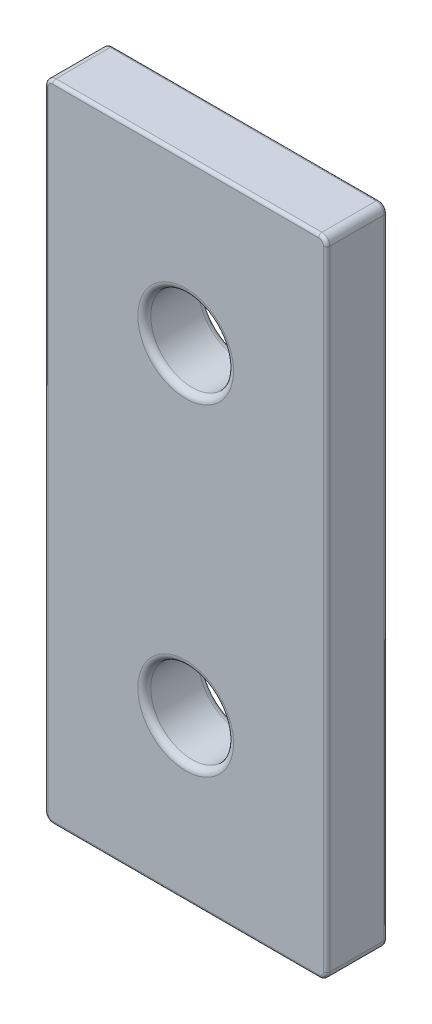
ISO-10303-21;
HEADER;
FILE_DESCRIPTION(('STEP AP214'),'2;1');
FILE_NAME('part.step','',(''),(''),'','','');
FILE_SCHEMA(('AUTOMOTIVE_DESIGN { 1 0 10303 214 1 1 1 1 }'));
ENDSEC;
DATA;
#1=APPLICATION_CONTEXT('core data for automotive mechanical design processes');
#2=APPLICATION_PROTOCOL_DEFINITION('international standard','automotive_design',2000,#1);
#3=PRODUCT_CONTEXT('',#1,'mechanical');
#4=PRODUCT('Part','Part','',(#3));
#5=PRODUCT_RELATED_PRODUCT_CATEGORY('part','',(#4));
#6=PRODUCT_DEFINITION_FORMATION('','',#4);
#7=PRODUCT_DEFINITION_CONTEXT('part definition',#1,'design');
#8=PRODUCT_DEFINITION('design','',#6,#7);
#9=PRODUCT_DEFINITION_SHAPE('','',#8);
#10=(LENGTH_UNIT() NAMED_UNIT(*) SI_UNIT(.MILLI.,.METRE.));
#11=(NAMED_UNIT(*) PLANE_ANGLE_UNIT() SI_UNIT($,.RADIAN.));
#12=(NAMED_UNIT(*) SI_UNIT($,.STERADIAN.) SOLID_ANGLE_UNIT());
#13=UNCERTAINTY_MEASURE_WITH_UNIT(LENGTH_MEASURE(1.E-05),#10,'distance_accuracy_value','');
#14=(GEOMETRIC_REPRESENTATION_CONTEXT(3) GLOBAL_UNCERTAINTY_ASSIGNED_CONTEXT((#13)) GLOBAL_UNIT_ASSIGNED_CONTEXT((#10,
#11,#12)) REPRESENTATION_CONTEXT('',''));
#15=CARTESIAN_POINT('',(0.,0.,0.));
#16=DIRECTION('',(0.,0.,1.));
#17=DIRECTION('',(1.,0.,0.));
#18=AXIS2_PLACEMENT_3D('',#15,#16,#17);
#19=CARTESIAN_POINT('',(-11.1125,25.4,2.3876));
#20=DIRECTION('',(0.,-1.,0.));
#21=DIRECTION('',(0.,0.,-1.));
#22=AXIS2_PLACEMENT_3D('',#19,#20,#21);
#23=PLANE('',#22);
#24=DIRECTION('',(0.,0.,-1.));
#25=VECTOR('',#24,1.);
#26=CARTESIAN_POINT('',(10.4775,25.4,2.3876));
#27=LINE('',#26,#25);
#28=CARTESIAN_POINT('',(10.4775,25.4,2.1336));
#29=VERTEX_POINT('',#28);
#30=CARTESIAN_POINT('',(10.4775,25.4,-2.1336));
#31=VERTEX_POINT('',#30);
#32=EDGE_CURVE('E195',#29,#31,#27,.T.);
#33=ORIENTED_EDGE('',*,*,#32,.T.);
#34=DIRECTION('',(-1.,0.,0.));
#35=VECTOR('',#34,1.);
#36=CARTESIAN_POINT('',(-10.4775,25.4,-2.1336));
#37=LINE('',#36,#35);
#38=CARTESIAN_POINT('',(-10.4775,25.4,-2.1336));
#39=VERTEX_POINT('',#38);
#40=EDGE_CURVE('E251',#31,#39,#37,.T.);
#41=ORIENTED_EDGE('',*,*,#40,.T.);
#42=DIRECTION('',(0.,0.,-1.));
#43=VECTOR('',#42,1.);
#44=CARTESIAN_POINT('',(-10.4775,25.4,2.3876));
#45=LINE('',#44,#43);
#46=CARTESIAN_POINT('',(-10.4775,25.4,2.1336));
#47=VERTEX_POINT('',#46);
#48=EDGE_CURVE('E190',#39,#47,#45,.F.);
#49=ORIENTED_EDGE('',*,*,#48,.T.);
#50=DIRECTION('',(-1.,0.,0.));
#51=VECTOR('',#50,1.);
#52=CARTESIAN_POINT('',(-11.1125,25.4,2.1336));
#53=LINE('',#52,#51);
#54=EDGE_CURVE('E248',#47,#29,#53,.F.);
#55=ORIENTED_EDGE('',*,*,#54,.T.);
#56=EDGE_LOOP('',(#33,#41,#49,#55));
#57=FACE_BOUND('',#56,.T.);
#58=ADVANCED_FACE('F48',(#57),#23,.F.);
#59=CARTESIAN_POINT('',(-11.1125,25.4,2.3876));
#60=DIRECTION('',(1.,0.,0.));
#61=DIRECTION('',(0.,0.,-1.));
#62=AXIS2_PLACEMENT_3D('',#59,#60,#61);
#63=PLANE('',#62);
#64=DIRECTION('',(0.,0.,-1.));
#65=VECTOR('',#64,1.);
#66=CARTESIAN_POINT('',(-11.1125,24.765,2.3876));
#67=LINE('',#66,#65);
#68=CARTESIAN_POINT('',(-11.1125,24.765,2.1336));
#69=VERTEX_POINT('',#68);
#70=CARTESIAN_POINT('',(-11.1125,24.765,-2.1336));
#71=VERTEX_POINT('',#70);
#72=EDGE_CURVE('E537',#69,#71,#67,.T.);
#73=ORIENTED_EDGE('',*,*,#72,.T.);
#74=DIRECTION('',(0.,-1.,0.));
#75=VECTOR('',#74,1.);
#76=CARTESIAN_POINT('',(-11.1125,-24.765,-2.1336));
#77=LINE('',#76,#75);
#78=CARTESIAN_POINT('',(-11.1125,-24.765,-2.1336));
#79=VERTEX_POINT('',#78);
#80=EDGE_CURVE('E239',#71,#79,#77,.T.);
#81=ORIENTED_EDGE('',*,*,#80,.T.);
#82=DIRECTION('',(0.,0.,-1.));
#83=VECTOR('',#82,1.);
#84=CARTESIAN_POINT('',(-11.1125,-24.765,2.3876));
#85=LINE('',#84,#83);
#86=CARTESIAN_POINT('',(-11.1125,-24.765,2.1336));
#87=VERTEX_POINT('',#86);
#88=EDGE_CURVE('E541',#79,#87,#85,.F.);
#89=ORIENTED_EDGE('',*,*,#88,.T.);
#90=DIRECTION('',(0.,-1.,0.));
#91=VECTOR('',#90,1.);
#92=CARTESIAN_POINT('',(-11.1125,25.4,2.1336));
#93=LINE('',#92,#91);
#94=EDGE_CURVE('E236',#87,#69,#93,.F.);
#95=ORIENTED_EDGE('',*,*,#94,.T.);
#96=EDGE_LOOP('',(#73,#81,#89,#95));
#97=FACE_BOUND('',#96,.T.);
#98=ADVANCED_FACE('F393',(#97),#63,.F.);
#99=CARTESIAN_POINT('',(-11.1125,-25.4,2.3876));
#100=DIRECTION('',(0.,1.,0.));
#101=DIRECTION('',(0.,0.,1.));
#102=AXIS2_PLACEMENT_3D('',#99,#100,#101);
#103=PLANE('',#102);
#104=DIRECTION('',(0.,0.,-1.));
#105=VECTOR('',#104,1.);
#106=CARTESIAN_POINT('',(-10.4775,-25.4,2.3876));
#107=LINE('',#106,#105);
#108=CARTESIAN_POINT('',(-10.4775,-25.4,2.1336));
#109=VERTEX_POINT('',#108);
#110=CARTESIAN_POINT('',(-10.4775,-25.4,-2.1336));
#111=VERTEX_POINT('',#110);
#112=EDGE_CURVE('E507',#109,#111,#107,.T.);
#113=ORIENTED_EDGE('',*,*,#112,.T.);
#114=DIRECTION('',(1.,0.,0.));
#115=VECTOR('',#114,1.);
#116=CARTESIAN_POINT('',(10.4775,-25.4,-2.1336));
#117=LINE('',#116,#115);
#118=CARTESIAN_POINT('',(10.4775,-25.4,-2.1336));
#119=VERTEX_POINT('',#118);
#120=EDGE_CURVE('E227',#111,#119,#117,.T.);
#121=ORIENTED_EDGE('',*,*,#120,.T.);
#122=DIRECTION('',(0.,0.,-1.));
#123=VECTOR('',#122,1.);
#124=CARTESIAN_POINT('',(10.4775,-25.4,2.3876));
#125=LINE('',#124,#123);
#126=CARTESIAN_POINT('',(10.4775,-25.4,2.1336));
#127=VERTEX_POINT('',#126);
#128=EDGE_CURVE('E515',#119,#127,#125,.F.);
#129=ORIENTED_EDGE('',*,*,#128,.T.);
#130=DIRECTION('',(1.,0.,0.));
#131=VECTOR('',#130,1.);
#132=CARTESIAN_POINT('',(-11.1125,-25.4,2.1336));
#133=LINE('',#132,#131);
#134=EDGE_CURVE('E224',#127,#109,#133,.F.);
#135=ORIENTED_EDGE('',*,*,#134,.T.);
#136=EDGE_LOOP('',(#113,#121,#129,#135));
#137=FACE_BOUND('',#136,.T.);
#138=ADVANCED_FACE('F399',(#137),#103,.F.);
#139=CARTESIAN_POINT('',(11.1125,25.4,2.3876));
#140=DIRECTION('',(-1.,0.,0.));
#141=DIRECTION('',(0.,0.,1.));
#142=AXIS2_PLACEMENT_3D('',#139,#140,#141);
#143=PLANE('',#142);
#144=DIRECTION('',(0.,0.,-1.));
#145=VECTOR('',#144,1.);
#146=CARTESIAN_POINT('',(11.1125,-24.765,2.3876));
#147=LINE('',#146,#145);
#148=CARTESIAN_POINT('',(11.1125,-24.765,2.1336));
#149=VERTEX_POINT('',#148);
#150=CARTESIAN_POINT('',(11.1125,-24.765,-2.1336));
#151=VERTEX_POINT('',#150);
#152=EDGE_CURVE('E516',#149,#151,#147,.T.);
#153=ORIENTED_EDGE('',*,*,#152,.T.);
#154=DIRECTION('',(0.,1.,0.));
#155=VECTOR('',#154,1.);
#156=CARTESIAN_POINT('',(11.1125,24.765,-2.1336));
#157=LINE('',#156,#155);
#158=CARTESIAN_POINT('',(11.1125,24.765,-2.1336));
#159=VERTEX_POINT('',#158);
#160=EDGE_CURVE('E284',#151,#159,#157,.T.);
#161=ORIENTED_EDGE('',*,*,#160,.T.);
#162=DIRECTION('',(0.,0.,-1.));
#163=VECTOR('',#162,1.);
#164=CARTESIAN_POINT('',(11.1125,24.765,2.3876));
#165=LINE('',#164,#163);
#166=CARTESIAN_POINT('',(11.1125,24.765,2.1336));
#167=VERTEX_POINT('',#166);
#168=EDGE_CURVE('E311',#159,#167,#165,.F.);
#169=ORIENTED_EDGE('',*,*,#168,.T.);
#170=DIRECTION('',(0.,1.,0.));
#171=VECTOR('',#170,1.);
#172=CARTESIAN_POINT('',(11.1125,25.4,2.1336));
#173=LINE('',#172,#171);
#174=EDGE_CURVE('E281',#167,#149,#173,.F.);
#175=ORIENTED_EDGE('',*,*,#174,.T.);
#176=EDGE_LOOP('',(#153,#161,#169,#175));
#177=FACE_BOUND('',#176,.T.);
#178=ADVANCED_FACE('F491',(#177),#143,.F.);
#179=CARTESIAN_POINT('',(0.,0.,2.3876));
#180=DIRECTION('',(0.,0.,-1.));
#181=DIRECTION('',(-1.,0.,0.));
#182=AXIS2_PLACEMENT_3D('',#179,#180,#181);
#183=PLANE('',#182);
#184=CARTESIAN_POINT('',(0.,12.7,2.3876));
#185=DIRECTION('',(0.,0.,-1.));
#186=DIRECTION('',(-1.,0.,0.));
#187=AXIS2_PLACEMENT_3D('',#184,#185,#186);
#188=CIRCLE('',#187,3.7719);
#189=CARTESIAN_POINT('',(-3.7719,12.7,2.3876));
#190=VERTEX_POINT('',#189);
#191=EDGE_CURVE('E11',#190,#190,#188,.T.);
#192=ORIENTED_EDGE('',*,*,#191,.T.);
#193=EDGE_LOOP('',(#192));
#194=FACE_BOUND('',#193,.T.);
#195=CARTESIAN_POINT('',(0.,-12.7,2.3876));
#196=DIRECTION('',(0.,0.,-1.));
#197=DIRECTION('',(-1.,0.,0.));
#198=AXIS2_PLACEMENT_3D('',#195,#196,#197);
#199=CIRCLE('',#198,3.7719);
#200=CARTESIAN_POINT('',(-3.7719,-12.7,2.3876));
#201=VERTEX_POINT('',#200);
#202=EDGE_CURVE('E57',#201,#201,#199,.T.);
#203=ORIENTED_EDGE('',*,*,#202,.T.);
#204=EDGE_LOOP('',(#203));
#205=FACE_BOUND('',#204,.T.);
#206=DIRECTION('',(1.,0.,0.));
#207=VECTOR('',#206,1.);
#208=CARTESIAN_POINT('',(0.,-25.146,2.3876));
#209=LINE('',#208,#207);
#210=CARTESIAN_POINT('',(-10.4775,-25.146,2.3876));
#211=VERTEX_POINT('',#210);
#212=CARTESIAN_POINT('',(10.4775,-25.146,2.3876));
#213=VERTEX_POINT('',#212);
#214=EDGE_CURVE('E64',#211,#213,#209,.T.);
#215=ORIENTED_EDGE('',*,*,#214,.T.);
#216=CARTESIAN_POINT('',(10.4775,-24.765,2.3876));
#217=DIRECTION('',(0.,0.,-1.));
#218=DIRECTION('',(-1.,0.,0.));
#219=AXIS2_PLACEMENT_3D('',#216,#217,#218);
#220=CIRCLE('',#219,0.381);
#221=CARTESIAN_POINT('',(10.8585,-24.765,2.3876));
#222=VERTEX_POINT('',#221);
#223=EDGE_CURVE('E278',#213,#222,#220,.F.);
#224=ORIENTED_EDGE('',*,*,#223,.T.);
#225=DIRECTION('',(0.,1.,0.));
#226=VECTOR('',#225,1.);
#227=CARTESIAN_POINT('',(10.8585,0.,2.3876));
#228=LINE('',#227,#226);
#229=CARTESIAN_POINT('',(10.8585,24.765,2.3876));
#230=VERTEX_POINT('',#229);
#231=EDGE_CURVE('E259',#222,#230,#228,.T.);
#232=ORIENTED_EDGE('',*,*,#231,.T.);
#233=CARTESIAN_POINT('',(10.4775,24.765,2.3876));
#234=DIRECTION('',(0.,0.,-1.));
#235=DIRECTION('',(-1.,0.,0.));
#236=AXIS2_PLACEMENT_3D('',#233,#234,#235);
#237=CIRCLE('',#236,0.381);
#238=CARTESIAN_POINT('',(10.4775,25.146,2.3876));
#239=VERTEX_POINT('',#238);
#240=EDGE_CURVE('E262',#230,#239,#237,.F.);
#241=ORIENTED_EDGE('',*,*,#240,.T.);
#242=DIRECTION('',(-1.,0.,0.));
#243=VECTOR('',#242,1.);
#244=CARTESIAN_POINT('',(0.,25.146,2.3876));
#245=LINE('',#244,#243);
#246=CARTESIAN_POINT('',(-10.4775,25.146,2.3876));
#247=VERTEX_POINT('',#246);
#248=EDGE_CURVE('E265',#239,#247,#245,.T.);
#249=ORIENTED_EDGE('',*,*,#248,.T.);
#250=CARTESIAN_POINT('',(-10.4775,24.765,2.3876));
#251=DIRECTION('',(0.,0.,-1.));
#252=DIRECTION('',(-1.,0.,0.));
#253=AXIS2_PLACEMENT_3D('',#250,#251,#252);
#254=CIRCLE('',#253,0.381);
#255=CARTESIAN_POINT('',(-10.8585,24.765,2.3876));
#256=VERTEX_POINT('',#255);
#257=EDGE_CURVE('E268',#247,#256,#254,.F.);
#258=ORIENTED_EDGE('',*,*,#257,.T.);
#259=DIRECTION('',(0.,-1.,0.));
#260=VECTOR('',#259,1.);
#261=CARTESIAN_POINT('',(-10.8585,0.,2.3876));
#262=LINE('',#261,#260);
#263=CARTESIAN_POINT('',(-10.8585,-24.765,2.3876));
#264=VERTEX_POINT('',#263);
#265=EDGE_CURVE('E271',#256,#264,#262,.T.);
#266=ORIENTED_EDGE('',*,*,#265,.T.);
#267=CARTESIAN_POINT('',(-10.4775,-24.765,2.3876));
#268=DIRECTION('',(0.,0.,-1.));
#269=DIRECTION('',(-1.,0.,0.));
#270=AXIS2_PLACEMENT_3D('',#267,#268,#269);
#271=CIRCLE('',#270,0.381);
#272=EDGE_CURVE('E69',#264,#211,#271,.F.);
#273=ORIENTED_EDGE('',*,*,#272,.T.);
#274=EDGE_LOOP('',(#215,#224,#232,#241,#249,#258,#266,#273));
#275=FACE_BOUND('',#274,.T.);
#276=ADVANCED_FACE('F368',(#194,#205,#275),#183,.F.);
#277=CARTESIAN_POINT('',(0.,0.,-2.3876));
#278=DIRECTION('',(0.,0.,-1.));
#279=DIRECTION('',(-1.,0.,0.));
#280=AXIS2_PLACEMENT_3D('',#277,#278,#279);
#281=PLANE('',#280);
#282=CARTESIAN_POINT('',(0.,12.7,-2.3876));
#283=DIRECTION('',(0.,0.,-1.));
#284=DIRECTION('',(-1.,0.,0.));
#285=AXIS2_PLACEMENT_3D('',#282,#283,#284);
#286=CIRCLE('',#285,3.7719);
#287=CARTESIAN_POINT('',(-3.7719,12.7,-2.3876));
#288=VERTEX_POINT('',#287);
#289=EDGE_CURVE('E344',#288,#288,#286,.F.);
#290=ORIENTED_EDGE('',*,*,#289,.T.);
#291=EDGE_LOOP('',(#290));
#292=FACE_BOUND('',#291,.T.);
#293=CARTESIAN_POINT('',(0.,-12.7,-2.3876));
#294=DIRECTION('',(0.,0.,-1.));
#295=DIRECTION('',(-1.,0.,0.));
#296=AXIS2_PLACEMENT_3D('',#293,#294,#295);
#297=CIRCLE('',#296,3.7719);
#298=CARTESIAN_POINT('',(-3.7719,-12.7,-2.3876));
#299=VERTEX_POINT('',#298);
#300=EDGE_CURVE('E287',#299,#299,#297,.F.);
#301=ORIENTED_EDGE('',*,*,#300,.T.);
#302=EDGE_LOOP('',(#301));
#303=FACE_BOUND('',#302,.T.);
#304=DIRECTION('',(0.,1.,0.));
#305=VECTOR('',#304,1.);
#306=CARTESIAN_POINT('',(10.8585,-24.765,-2.3876));
#307=LINE('',#306,#305);
#308=CARTESIAN_POINT('',(10.8585,24.765,-2.3876));
#309=VERTEX_POINT('',#308);
#310=CARTESIAN_POINT('',(10.8585,-24.765,-2.3876));
#311=VERTEX_POINT('',#310);
#312=EDGE_CURVE('E166',#309,#311,#307,.F.);
#313=ORIENTED_EDGE('',*,*,#312,.T.);
#314=CARTESIAN_POINT('',(10.4775,-24.765,-2.3876));
#315=DIRECTION('',(0.,0.,-1.));
#316=DIRECTION('',(-1.,0.,0.));
#317=AXIS2_PLACEMENT_3D('',#314,#315,#316);
#318=CIRCLE('',#317,0.381);
#319=CARTESIAN_POINT('',(10.4775,-25.146,-2.3876));
#320=VERTEX_POINT('',#319);
#321=EDGE_CURVE('E213',#311,#320,#318,.T.);
#322=ORIENTED_EDGE('',*,*,#321,.T.);
#323=DIRECTION('',(1.,0.,0.));
#324=VECTOR('',#323,1.);
#325=CARTESIAN_POINT('',(-10.4775,-25.146,-2.3876));
#326=LINE('',#325,#324);
#327=CARTESIAN_POINT('',(-10.4775,-25.146,-2.3876));
#328=VERTEX_POINT('',#327);
#329=EDGE_CURVE('E210',#320,#328,#326,.F.);
#330=ORIENTED_EDGE('',*,*,#329,.T.);
#331=CARTESIAN_POINT('',(-10.4775,-24.765,-2.3876));
#332=DIRECTION('',(0.,0.,-1.));
#333=DIRECTION('',(-1.,0.,0.));
#334=AXIS2_PLACEMENT_3D('',#331,#332,#333);
#335=CIRCLE('',#334,0.381);
#336=CARTESIAN_POINT('',(-10.8585,-24.765,-2.3876));
#337=VERTEX_POINT('',#336);
#338=EDGE_CURVE('E207',#328,#337,#335,.T.);
#339=ORIENTED_EDGE('',*,*,#338,.T.);
#340=DIRECTION('',(0.,-1.,0.));
#341=VECTOR('',#340,1.);
#342=CARTESIAN_POINT('',(-10.8585,24.765,-2.3876));
#343=LINE('',#342,#341);
#344=CARTESIAN_POINT('',(-10.8585,24.765,-2.3876));
#345=VERTEX_POINT('',#344);
#346=EDGE_CURVE('E204',#337,#345,#343,.F.);
#347=ORIENTED_EDGE('',*,*,#346,.T.);
#348=CARTESIAN_POINT('',(-10.4775,24.765,-2.3876));
#349=DIRECTION('',(0.,0.,-1.));
#350=DIRECTION('',(-1.,0.,0.));
#351=AXIS2_PLACEMENT_3D('',#348,#349,#350);
#352=CIRCLE('',#351,0.381);
#353=CARTESIAN_POINT('',(-10.4775,25.146,-2.3876));
#354=VERTEX_POINT('',#353);
#355=EDGE_CURVE('E201',#345,#354,#352,.T.);
#356=ORIENTED_EDGE('',*,*,#355,.T.);
#357=DIRECTION('',(-1.,0.,0.));
#358=VECTOR('',#357,1.);
#359=CARTESIAN_POINT('',(10.4775,25.146,-2.3876));
#360=LINE('',#359,#358);
#361=CARTESIAN_POINT('',(10.4775,25.146,-2.3876));
#362=VERTEX_POINT('',#361);
#363=EDGE_CURVE('E169',#354,#362,#360,.F.);
#364=ORIENTED_EDGE('',*,*,#363,.T.);
#365=CARTESIAN_POINT('',(10.4775,24.765,-2.3876));
#366=DIRECTION('',(0.,0.,-1.));
#367=DIRECTION('',(-1.,0.,0.));
#368=AXIS2_PLACEMENT_3D('',#365,#366,#367);
#369=CIRCLE('',#368,0.381);
#370=EDGE_CURVE('E161',#362,#309,#369,.T.);
#371=ORIENTED_EDGE('',*,*,#370,.T.);
#372=EDGE_LOOP('',(#313,#322,#330,#339,#347,#356,#364,#371));
#373=FACE_BOUND('',#372,.T.);
#374=ADVANCED_FACE('F163',(#292,#303,#373),#281,.T.);
#375=CARTESIAN_POINT('',(10.4775,-24.765,2.3876));
#376=DIRECTION('',(0.,0.,-1.));
#377=DIRECTION('',(-1.,0.,0.));
#378=AXIS2_PLACEMENT_3D('',#375,#376,#377);
#379=CYLINDRICAL_SURFACE('',#378,0.635);
#380=ORIENTED_EDGE('',*,*,#128,.F.);
#381=CARTESIAN_POINT('',(10.4775,-24.765,-2.1336));
#382=DIRECTION('',(0.,0.,-1.));
#383=DIRECTION('',(-1.,0.,0.));
#384=AXIS2_PLACEMENT_3D('',#381,#382,#383);
#385=CIRCLE('',#384,0.635);
#386=EDGE_CURVE('E220',#119,#151,#385,.F.);
#387=ORIENTED_EDGE('',*,*,#386,.T.);
#388=ORIENTED_EDGE('',*,*,#152,.F.);
#389=CARTESIAN_POINT('',(10.4775,-24.765,2.1336));
#390=DIRECTION('',(0.,0.,-1.));
#391=DIRECTION('',(-1.,0.,0.));
#392=AXIS2_PLACEMENT_3D('',#389,#390,#391);
#393=CIRCLE('',#392,0.635);
#394=EDGE_CURVE('E216',#149,#127,#393,.T.);
#395=ORIENTED_EDGE('',*,*,#394,.T.);
#396=EDGE_LOOP('',(#380,#387,#388,#395));
#397=FACE_BOUND('',#396,.T.);
#398=ADVANCED_FACE('F405',(#397),#379,.T.);
#399=CARTESIAN_POINT('',(-10.4775,-24.765,2.3876));
#400=DIRECTION('',(0.,0.,-1.));
#401=DIRECTION('',(-1.,0.,0.));
#402=AXIS2_PLACEMENT_3D('',#399,#400,#401);
#403=CYLINDRICAL_SURFACE('',#402,0.635);
#404=ORIENTED_EDGE('',*,*,#88,.F.);
#405=CARTESIAN_POINT('',(-10.4775,-24.765,-2.1336));
#406=DIRECTION('',(0.,0.,-1.));
#407=DIRECTION('',(-1.,0.,0.));
#408=AXIS2_PLACEMENT_3D('',#405,#406,#407);
#409=CIRCLE('',#408,0.635);
#410=EDGE_CURVE('E233',#79,#111,#409,.F.);
#411=ORIENTED_EDGE('',*,*,#410,.T.);
#412=ORIENTED_EDGE('',*,*,#112,.F.);
#413=CARTESIAN_POINT('',(-10.4775,-24.765,2.1336));
#414=DIRECTION('',(0.,0.,-1.));
#415=DIRECTION('',(-1.,0.,0.));
#416=AXIS2_PLACEMENT_3D('',#413,#414,#415);
#417=CIRCLE('',#416,0.635);
#418=EDGE_CURVE('E230',#109,#87,#417,.T.);
#419=ORIENTED_EDGE('',*,*,#418,.T.);
#420=EDGE_LOOP('',(#404,#411,#412,#419));
#421=FACE_BOUND('',#420,.T.);
#422=ADVANCED_FACE('F408',(#421),#403,.T.);
#423=CARTESIAN_POINT('',(-10.4775,24.765,2.3876));
#424=DIRECTION('',(0.,0.,-1.));
#425=DIRECTION('',(-1.,0.,0.));
#426=AXIS2_PLACEMENT_3D('',#423,#424,#425);
#427=CYLINDRICAL_SURFACE('',#426,0.635);
#428=ORIENTED_EDGE('',*,*,#48,.F.);
#429=CARTESIAN_POINT('',(-10.4775,24.765,-2.1336));
#430=DIRECTION('',(0.,0.,-1.));
#431=DIRECTION('',(-1.,0.,0.));
#432=AXIS2_PLACEMENT_3D('',#429,#430,#431);
#433=CIRCLE('',#432,0.635);
#434=EDGE_CURVE('E245',#39,#71,#433,.F.);
#435=ORIENTED_EDGE('',*,*,#434,.T.);
#436=ORIENTED_EDGE('',*,*,#72,.F.);
#437=CARTESIAN_POINT('',(-10.4775,24.765,2.1336));
#438=DIRECTION('',(0.,0.,-1.));
#439=DIRECTION('',(-1.,0.,0.));
#440=AXIS2_PLACEMENT_3D('',#437,#438,#439);
#441=CIRCLE('',#440,0.635);
#442=EDGE_CURVE('E242',#69,#47,#441,.T.);
#443=ORIENTED_EDGE('',*,*,#442,.T.);
#444=EDGE_LOOP('',(#428,#435,#436,#443));
#445=FACE_BOUND('',#444,.T.);
#446=ADVANCED_FACE('F412',(#445),#427,.T.);
#447=CARTESIAN_POINT('',(10.4775,24.765,2.3876));
#448=DIRECTION('',(0.,0.,-1.));
#449=DIRECTION('',(-1.,0.,0.));
#450=AXIS2_PLACEMENT_3D('',#447,#448,#449);
#451=CYLINDRICAL_SURFACE('',#450,0.635);
#452=ORIENTED_EDGE('',*,*,#168,.F.);
#453=CARTESIAN_POINT('',(10.4775,24.765,-2.1336));
#454=DIRECTION('',(0.,0.,-1.));
#455=DIRECTION('',(-1.,0.,0.));
#456=AXIS2_PLACEMENT_3D('',#453,#454,#455);
#457=CIRCLE('',#456,0.635);
#458=EDGE_CURVE('E179',#159,#31,#457,.F.);
#459=ORIENTED_EDGE('',*,*,#458,.T.);
#460=ORIENTED_EDGE('',*,*,#32,.F.);
#461=CARTESIAN_POINT('',(10.4775,24.765,2.1336));
#462=DIRECTION('',(0.,0.,-1.));
#463=DIRECTION('',(-1.,0.,0.));
#464=AXIS2_PLACEMENT_3D('',#461,#462,#463);
#465=CIRCLE('',#464,0.635);
#466=EDGE_CURVE('E254',#29,#167,#465,.T.);
#467=ORIENTED_EDGE('',*,*,#466,.T.);
#468=EDGE_LOOP('',(#452,#459,#460,#467));
#469=FACE_BOUND('',#468,.T.);
#470=ADVANCED_FACE('F389',(#469),#451,.T.);
#471=CARTESIAN_POINT('',(0.,12.7,-2.3876));
#472=DIRECTION('',(0.,0.,1.));
#473=DIRECTION('',(1.,0.,0.));
#474=AXIS2_PLACEMENT_3D('',#471,#472,#473);
#475=CYLINDRICAL_SURFACE('',#474,3.2639);
#476=CARTESIAN_POINT('',(0.,12.7,-1.8796));
#477=DIRECTION('',(0.,0.,-1.));
#478=DIRECTION('',(-1.,0.,0.));
#479=AXIS2_PLACEMENT_3D('',#476,#477,#478);
#480=CIRCLE('',#479,3.2639);
#481=CARTESIAN_POINT('',(-3.2639,12.7,-1.8796));
#482=VERTEX_POINT('',#481);
#483=EDGE_CURVE('E352',#482,#482,#480,.T.);
#484=ORIENTED_EDGE('',*,*,#483,.T.);
#485=EDGE_LOOP('',(#484));
#486=FACE_BOUND('',#485,.T.);
#487=CARTESIAN_POINT('',(0.,12.7,1.8796));
#488=DIRECTION('',(0.,0.,-1.));
#489=DIRECTION('',(-1.,0.,0.));
#490=AXIS2_PLACEMENT_3D('',#487,#488,#489);
#491=CIRCLE('',#490,3.2639);
#492=CARTESIAN_POINT('',(-3.2639,12.7,1.8796));
#493=VERTEX_POINT('',#492);
#494=EDGE_CURVE('E348',#493,#493,#491,.F.);
#495=ORIENTED_EDGE('',*,*,#494,.T.);
#496=EDGE_LOOP('',(#495));
#497=FACE_BOUND('',#496,.T.);
#498=ADVANCED_FACE('F378',(#486,#497),#475,.F.);
#499=CARTESIAN_POINT('',(0.,-12.7,-2.3876));
#500=DIRECTION('',(0.,0.,1.));
#501=DIRECTION('',(1.,0.,0.));
#502=AXIS2_PLACEMENT_3D('',#499,#500,#501);
#503=CYLINDRICAL_SURFACE('',#502,3.2639);
#504=CARTESIAN_POINT('',(0.,-12.7,-1.8796));
#505=DIRECTION('',(0.,0.,-1.));
#506=DIRECTION('',(-1.,0.,0.));
#507=AXIS2_PLACEMENT_3D('',#504,#505,#506);
#508=CIRCLE('',#507,3.2639);
#509=CARTESIAN_POINT('',(-3.2639,-12.7,-1.8796));
#510=VERTEX_POINT('',#509);
#511=EDGE_CURVE('E360',#510,#510,#508,.T.);
#512=ORIENTED_EDGE('',*,*,#511,.T.);
#513=EDGE_LOOP('',(#512));
#514=FACE_BOUND('',#513,.T.);
#515=CARTESIAN_POINT('',(0.,-12.7,1.8796));
#516=DIRECTION('',(0.,0.,-1.));
#517=DIRECTION('',(-1.,0.,0.));
#518=AXIS2_PLACEMENT_3D('',#515,#516,#517);
#519=CIRCLE('',#518,3.2639);
#520=CARTESIAN_POINT('',(-3.2639,-12.7,1.8796));
#521=VERTEX_POINT('',#520);
#522=EDGE_CURVE('E356',#521,#521,#519,.F.);
#523=ORIENTED_EDGE('',*,*,#522,.T.);
#524=EDGE_LOOP('',(#523));
#525=FACE_BOUND('',#524,.T.);
#526=ADVANCED_FACE('F375',(#514,#525),#503,.F.);
#527=CARTESIAN_POINT('',(-10.4775,24.765,-2.1336));
#528=DIRECTION('',(0.,0.,-1.));
#529=DIRECTION('',(-1.,0.,0.));
#530=AXIS2_PLACEMENT_3D('',#527,#528,#529);
#531=TOROIDAL_SURFACE('',#530,0.381,0.254);
#532=CARTESIAN_POINT('',(-10.8585,24.765,-2.1336));
#533=DIRECTION('',(0.,-1.,0.));
#534=DIRECTION('',(0.,0.,-1.));
#535=AXIS2_PLACEMENT_3D('',#532,#533,#534);
#536=CIRCLE('',#535,0.254);
#537=EDGE_CURVE('E303',#71,#345,#536,.T.);
#538=ORIENTED_EDGE('',*,*,#537,.F.);
#539=ORIENTED_EDGE('',*,*,#434,.F.);
#540=CARTESIAN_POINT('',(-10.4775,25.146,-2.1336));
#541=DIRECTION('',(1.,0.,0.));
#542=DIRECTION('',(0.,0.,-1.));
#543=AXIS2_PLACEMENT_3D('',#540,#541,#542);
#544=CIRCLE('',#543,0.254);
#545=EDGE_CURVE('E307',#354,#39,#544,.T.);
#546=ORIENTED_EDGE('',*,*,#545,.F.);
#547=ORIENTED_EDGE('',*,*,#355,.F.);
#548=EDGE_LOOP('',(#538,#539,#546,#547));
#549=FACE_BOUND('',#548,.T.);
#550=ADVANCED_FACE('F377',(#549),#531,.T.);
#551=CARTESIAN_POINT('',(-11.1125,25.146,-2.1336));
#552=DIRECTION('',(1.,0.,0.));
#553=DIRECTION('',(0.,0.,-1.));
#554=AXIS2_PLACEMENT_3D('',#551,#552,#553);
#555=CYLINDRICAL_SURFACE('',#554,0.254);
#556=ORIENTED_EDGE('',*,*,#545,.T.);
#557=ORIENTED_EDGE('',*,*,#40,.F.);
#558=CARTESIAN_POINT('',(10.4775,25.146,-2.1336));
#559=DIRECTION('',(1.,0.,0.));
#560=DIRECTION('',(0.,0.,-1.));
#561=AXIS2_PLACEMENT_3D('',#558,#559,#560);
#562=CIRCLE('',#561,0.254);
#563=EDGE_CURVE('E300',#362,#31,#562,.T.);
#564=ORIENTED_EDGE('',*,*,#563,.F.);
#565=ORIENTED_EDGE('',*,*,#363,.F.);
#566=EDGE_LOOP('',(#556,#557,#564,#565));
#567=FACE_BOUND('',#566,.T.);
#568=ADVANCED_FACE('F386',(#567),#555,.T.);
#569=CARTESIAN_POINT('',(-10.8585,25.4,-2.1336));
#570=DIRECTION('',(0.,1.,0.));
#571=DIRECTION('',(0.,0.,1.));
#572=AXIS2_PLACEMENT_3D('',#569,#570,#571);
#573=CYLINDRICAL_SURFACE('',#572,0.254);
#574=ORIENTED_EDGE('',*,*,#537,.T.);
#575=ORIENTED_EDGE('',*,*,#346,.F.);
#576=CARTESIAN_POINT('',(-10.8585,-24.765,-2.1336));
#577=DIRECTION('',(0.,-1.,0.));
#578=DIRECTION('',(0.,0.,-1.));
#579=AXIS2_PLACEMENT_3D('',#576,#577,#578);
#580=CIRCLE('',#579,0.254);
#581=EDGE_CURVE('E183',#79,#337,#580,.T.);
#582=ORIENTED_EDGE('',*,*,#581,.F.);
#583=ORIENTED_EDGE('',*,*,#80,.F.);
#584=EDGE_LOOP('',(#574,#575,#582,#583));
#585=FACE_BOUND('',#584,.T.);
#586=ADVANCED_FACE('F437',(#585),#573,.T.);
#587=CARTESIAN_POINT('',(10.4775,24.765,-2.1336));
#588=DIRECTION('',(0.,0.,-1.));
#589=DIRECTION('',(-1.,0.,0.));
#590=AXIS2_PLACEMENT_3D('',#587,#588,#589);
#591=TOROIDAL_SURFACE('',#590,0.381,0.254);
#592=ORIENTED_EDGE('',*,*,#563,.T.);
#593=ORIENTED_EDGE('',*,*,#458,.F.);
#594=CARTESIAN_POINT('',(10.8585,24.765,-2.1336));
#595=DIRECTION('',(0.,-1.,0.));
#596=DIRECTION('',(0.,0.,-1.));
#597=AXIS2_PLACEMENT_3D('',#594,#595,#596);
#598=CIRCLE('',#597,0.254);
#599=EDGE_CURVE('E177',#309,#159,#598,.T.);
#600=ORIENTED_EDGE('',*,*,#599,.F.);
#601=ORIENTED_EDGE('',*,*,#370,.F.);
#602=EDGE_LOOP('',(#592,#593,#600,#601));
#603=FACE_BOUND('',#602,.T.);
#604=ADVANCED_FACE('F178',(#603),#591,.T.);
#605=CARTESIAN_POINT('',(-10.4775,-24.765,-2.1336));
#606=DIRECTION('',(0.,0.,-1.));
#607=DIRECTION('',(-1.,0.,0.));
#608=AXIS2_PLACEMENT_3D('',#605,#606,#607);
#609=TOROIDAL_SURFACE('',#608,0.381,0.254);
#610=ORIENTED_EDGE('',*,*,#581,.T.);
#611=ORIENTED_EDGE('',*,*,#338,.F.);
#612=CARTESIAN_POINT('',(-10.4775,-25.146,-2.1336));
#613=DIRECTION('',(1.,0.,0.));
#614=DIRECTION('',(0.,0.,-1.));
#615=AXIS2_PLACEMENT_3D('',#612,#613,#614);
#616=CIRCLE('',#615,0.254);
#617=EDGE_CURVE('E184',#111,#328,#616,.T.);
#618=ORIENTED_EDGE('',*,*,#617,.F.);
#619=ORIENTED_EDGE('',*,*,#410,.F.);
#620=EDGE_LOOP('',(#610,#611,#618,#619));
#621=FACE_BOUND('',#620,.T.);
#622=ADVANCED_FACE('F431',(#621),#609,.T.);
#623=CARTESIAN_POINT('',(10.8585,25.4,-2.1336));
#624=DIRECTION('',(0.,-1.,0.));
#625=DIRECTION('',(0.,0.,-1.));
#626=AXIS2_PLACEMENT_3D('',#623,#624,#625);
#627=CYLINDRICAL_SURFACE('',#626,0.254);
#628=ORIENTED_EDGE('',*,*,#599,.T.);
#629=ORIENTED_EDGE('',*,*,#160,.F.);
#630=CARTESIAN_POINT('',(10.8585,-24.765,-2.1336));
#631=DIRECTION('',(0.,-1.,0.));
#632=DIRECTION('',(0.,0.,-1.));
#633=AXIS2_PLACEMENT_3D('',#630,#631,#632);
#634=CIRCLE('',#633,0.254);
#635=EDGE_CURVE('E187',#311,#151,#634,.T.);
#636=ORIENTED_EDGE('',*,*,#635,.F.);
#637=ORIENTED_EDGE('',*,*,#312,.F.);
#638=EDGE_LOOP('',(#628,#629,#636,#637));
#639=FACE_BOUND('',#638,.T.);
#640=ADVANCED_FACE('F186',(#639),#627,.T.);
#641=CARTESIAN_POINT('',(-11.1125,-25.146,-2.1336));
#642=DIRECTION('',(-1.,0.,0.));
#643=DIRECTION('',(0.,0.,1.));
#644=AXIS2_PLACEMENT_3D('',#641,#642,#643);
#645=CYLINDRICAL_SURFACE('',#644,0.254);
#646=ORIENTED_EDGE('',*,*,#617,.T.);
#647=ORIENTED_EDGE('',*,*,#329,.F.);
#648=CARTESIAN_POINT('',(10.4775,-25.146,-2.1336));
#649=DIRECTION('',(1.,0.,0.));
#650=DIRECTION('',(0.,0.,-1.));
#651=AXIS2_PLACEMENT_3D('',#648,#649,#650);
#652=CIRCLE('',#651,0.254);
#653=EDGE_CURVE('E288',#119,#320,#652,.T.);
#654=ORIENTED_EDGE('',*,*,#653,.F.);
#655=ORIENTED_EDGE('',*,*,#120,.F.);
#656=EDGE_LOOP('',(#646,#647,#654,#655));
#657=FACE_BOUND('',#656,.T.);
#658=ADVANCED_FACE('F424',(#657),#645,.T.);
#659=CARTESIAN_POINT('',(10.4775,-24.765,-2.1336));
#660=DIRECTION('',(0.,0.,-1.));
#661=DIRECTION('',(-1.,0.,0.));
#662=AXIS2_PLACEMENT_3D('',#659,#660,#661);
#663=TOROIDAL_SURFACE('',#662,0.381,0.254);
#664=ORIENTED_EDGE('',*,*,#635,.T.);
#665=ORIENTED_EDGE('',*,*,#386,.F.);
#666=ORIENTED_EDGE('',*,*,#653,.T.);
#667=ORIENTED_EDGE('',*,*,#321,.F.);
#668=EDGE_LOOP('',(#664,#665,#666,#667));
#669=FACE_BOUND('',#668,.T.);
#670=ADVANCED_FACE('F420',(#669),#663,.T.);
#671=CARTESIAN_POINT('',(-10.4775,24.765,2.1336));
#672=DIRECTION('',(0.,0.,-1.));
#673=DIRECTION('',(-1.,0.,0.));
#674=AXIS2_PLACEMENT_3D('',#671,#672,#673);
#675=TOROIDAL_SURFACE('',#674,0.381,0.254);
#676=CARTESIAN_POINT('',(-10.4775,25.146,2.1336));
#677=DIRECTION('',(1.,0.,0.));
#678=DIRECTION('',(0.,0.,-1.));
#679=AXIS2_PLACEMENT_3D('',#676,#677,#678);
#680=CIRCLE('',#679,0.254);
#681=EDGE_CURVE('E334',#47,#247,#680,.T.);
#682=ORIENTED_EDGE('',*,*,#681,.F.);
#683=ORIENTED_EDGE('',*,*,#442,.F.);
#684=CARTESIAN_POINT('',(-10.8585,24.765,2.1336));
#685=DIRECTION('',(0.,-1.,0.));
#686=DIRECTION('',(0.,0.,-1.));
#687=AXIS2_PLACEMENT_3D('',#684,#685,#686);
#688=CIRCLE('',#687,0.254);
#689=EDGE_CURVE('E291',#256,#69,#688,.T.);
#690=ORIENTED_EDGE('',*,*,#689,.F.);
#691=ORIENTED_EDGE('',*,*,#257,.F.);
#692=EDGE_LOOP('',(#682,#683,#690,#691));
#693=FACE_BOUND('',#692,.T.);
#694=ADVANCED_FACE('F423',(#693),#675,.T.);
#695=CARTESIAN_POINT('',(-10.8585,0.,2.1336));
#696=DIRECTION('',(0.,-1.,0.));
#697=DIRECTION('',(0.,0.,-1.));
#698=AXIS2_PLACEMENT_3D('',#695,#696,#697);
#699=CYLINDRICAL_SURFACE('',#698,0.254);
#700=ORIENTED_EDGE('',*,*,#689,.T.);
#701=ORIENTED_EDGE('',*,*,#94,.F.);
#702=CARTESIAN_POINT('',(-10.8585,-24.765,2.1336));
#703=DIRECTION('',(0.,-1.,0.));
#704=DIRECTION('',(0.,0.,-1.));
#705=AXIS2_PLACEMENT_3D('',#702,#703,#704);
#706=CIRCLE('',#705,0.254);
#707=EDGE_CURVE('E330',#264,#87,#706,.T.);
#708=ORIENTED_EDGE('',*,*,#707,.F.);
#709=ORIENTED_EDGE('',*,*,#265,.F.);
#710=EDGE_LOOP('',(#700,#701,#708,#709));
#711=FACE_BOUND('',#710,.T.);
#712=ADVANCED_FACE('F468',(#711),#699,.T.);
#713=CARTESIAN_POINT('',(0.,25.146,2.1336));
#714=DIRECTION('',(-1.,0.,0.));
#715=DIRECTION('',(0.,0.,1.));
#716=AXIS2_PLACEMENT_3D('',#713,#714,#715);
#717=CYLINDRICAL_SURFACE('',#716,0.254);
#718=ORIENTED_EDGE('',*,*,#681,.T.);
#719=ORIENTED_EDGE('',*,*,#248,.F.);
#720=CARTESIAN_POINT('',(10.4775,25.146,2.1336));
#721=DIRECTION('',(1.,0.,0.));
#722=DIRECTION('',(0.,0.,-1.));
#723=AXIS2_PLACEMENT_3D('',#720,#721,#722);
#724=CIRCLE('',#723,0.254);
#725=EDGE_CURVE('E326',#29,#239,#724,.T.);
#726=ORIENTED_EDGE('',*,*,#725,.F.);
#727=ORIENTED_EDGE('',*,*,#54,.F.);
#728=EDGE_LOOP('',(#718,#719,#726,#727));
#729=FACE_BOUND('',#728,.T.);
#730=ADVANCED_FACE('F464',(#729),#717,.T.);
#731=CARTESIAN_POINT('',(-10.4775,-24.765,2.1336));
#732=DIRECTION('',(0.,0.,-1.));
#733=DIRECTION('',(-1.,0.,0.));
#734=AXIS2_PLACEMENT_3D('',#731,#732,#733);
#735=TOROIDAL_SURFACE('',#734,0.381,0.254);
#736=ORIENTED_EDGE('',*,*,#707,.T.);
#737=ORIENTED_EDGE('',*,*,#418,.F.);
#738=CARTESIAN_POINT('',(-10.4775,-25.146,2.1336));
#739=DIRECTION('',(1.,0.,0.));
#740=DIRECTION('',(0.,0.,-1.));
#741=AXIS2_PLACEMENT_3D('',#738,#739,#740);
#742=CIRCLE('',#741,0.254);
#743=EDGE_CURVE('E322',#211,#109,#742,.T.);
#744=ORIENTED_EDGE('',*,*,#743,.F.);
#745=ORIENTED_EDGE('',*,*,#272,.F.);
#746=EDGE_LOOP('',(#736,#737,#744,#745));
#747=FACE_BOUND('',#746,.T.);
#748=ADVANCED_FACE('F460',(#747),#735,.T.);
#749=CARTESIAN_POINT('',(10.4775,24.765,2.1336));
#750=DIRECTION('',(0.,0.,-1.));
#751=DIRECTION('',(-1.,0.,0.));
#752=AXIS2_PLACEMENT_3D('',#749,#750,#751);
#753=TOROIDAL_SURFACE('',#752,0.381,0.254);
#754=ORIENTED_EDGE('',*,*,#725,.T.);
#755=ORIENTED_EDGE('',*,*,#240,.F.);
#756=CARTESIAN_POINT('',(10.8585,24.765,2.1336));
#757=DIRECTION('',(0.,-1.,0.));
#758=DIRECTION('',(0.,0.,-1.));
#759=AXIS2_PLACEMENT_3D('',#756,#757,#758);
#760=CIRCLE('',#759,0.254);
#761=EDGE_CURVE('E318',#167,#230,#760,.T.);
#762=ORIENTED_EDGE('',*,*,#761,.F.);
#763=ORIENTED_EDGE('',*,*,#466,.F.);
#764=EDGE_LOOP('',(#754,#755,#762,#763));
#765=FACE_BOUND('',#764,.T.);
#766=ADVANCED_FACE('F456',(#765),#753,.T.);
#767=CARTESIAN_POINT('',(0.,-25.146,2.1336));
#768=DIRECTION('',(1.,0.,0.));
#769=DIRECTION('',(0.,0.,-1.));
#770=AXIS2_PLACEMENT_3D('',#767,#768,#769);
#771=CYLINDRICAL_SURFACE('',#770,0.254);
#772=ORIENTED_EDGE('',*,*,#743,.T.);
#773=ORIENTED_EDGE('',*,*,#134,.F.);
#774=CARTESIAN_POINT('',(10.4775,-25.146,2.1336));
#775=DIRECTION('',(1.,0.,0.));
#776=DIRECTION('',(0.,0.,-1.));
#777=AXIS2_PLACEMENT_3D('',#774,#775,#776);
#778=CIRCLE('',#777,0.254);
#779=EDGE_CURVE('E315',#213,#127,#778,.T.);
#780=ORIENTED_EDGE('',*,*,#779,.F.);
#781=ORIENTED_EDGE('',*,*,#214,.F.);
#782=EDGE_LOOP('',(#772,#773,#780,#781));
#783=FACE_BOUND('',#782,.T.);
#784=ADVANCED_FACE('F452',(#783),#771,.T.);
#785=CARTESIAN_POINT('',(10.8585,0.,2.1336));
#786=DIRECTION('',(0.,1.,0.));
#787=DIRECTION('',(0.,0.,1.));
#788=AXIS2_PLACEMENT_3D('',#785,#786,#787);
#789=CYLINDRICAL_SURFACE('',#788,0.254);
#790=ORIENTED_EDGE('',*,*,#761,.T.);
#791=ORIENTED_EDGE('',*,*,#231,.F.);
#792=CARTESIAN_POINT('',(10.8585,-24.765,2.1336));
#793=DIRECTION('',(0.,-1.,0.));
#794=DIRECTION('',(0.,0.,-1.));
#795=AXIS2_PLACEMENT_3D('',#792,#793,#794);
#796=CIRCLE('',#795,0.254);
#797=EDGE_CURVE('E312',#149,#222,#796,.T.);
#798=ORIENTED_EDGE('',*,*,#797,.F.);
#799=ORIENTED_EDGE('',*,*,#174,.F.);
#800=EDGE_LOOP('',(#790,#791,#798,#799));
#801=FACE_BOUND('',#800,.T.);
#802=ADVANCED_FACE('F448',(#801),#789,.T.);
#803=CARTESIAN_POINT('',(10.4775,-24.765,2.1336));
#804=DIRECTION('',(0.,0.,-1.));
#805=DIRECTION('',(-1.,0.,0.));
#806=AXIS2_PLACEMENT_3D('',#803,#804,#805);
#807=TOROIDAL_SURFACE('',#806,0.381,0.254);
#808=ORIENTED_EDGE('',*,*,#779,.T.);
#809=ORIENTED_EDGE('',*,*,#394,.F.);
#810=ORIENTED_EDGE('',*,*,#797,.T.);
#811=ORIENTED_EDGE('',*,*,#223,.F.);
#812=EDGE_LOOP('',(#808,#809,#810,#811));
#813=FACE_BOUND('',#812,.T.);
#814=ADVANCED_FACE('F444',(#813),#807,.T.);
#815=CARTESIAN_POINT('',(0.,12.7,-1.8796));
#816=DIRECTION('',(0.,0.,-1.));
#817=DIRECTION('',(-1.,0.,0.));
#818=AXIS2_PLACEMENT_3D('',#815,#816,#817);
#819=TOROIDAL_SURFACE('',#818,3.7719,0.508);
#820=ORIENTED_EDGE('',*,*,#483,.F.);
#821=EDGE_LOOP('',(#820));
#822=FACE_BOUND('',#821,.T.);
#823=ORIENTED_EDGE('',*,*,#289,.F.);
#824=EDGE_LOOP('',(#823));
#825=FACE_BOUND('',#824,.T.);
#826=ADVANCED_FACE('F447',(#822,#825),#819,.T.);
#827=CARTESIAN_POINT('',(0.,-12.7,-1.8796));
#828=DIRECTION('',(0.,0.,-1.));
#829=DIRECTION('',(-1.,0.,0.));
#830=AXIS2_PLACEMENT_3D('',#827,#828,#829);
#831=TOROIDAL_SURFACE('',#830,3.7719,0.508);
#832=ORIENTED_EDGE('',*,*,#511,.F.);
#833=EDGE_LOOP('',(#832));
#834=FACE_BOUND('',#833,.T.);
#835=ORIENTED_EDGE('',*,*,#300,.F.);
#836=EDGE_LOOP('',(#835));
#837=FACE_BOUND('',#836,.T.);
#838=ADVANCED_FACE('F477',(#834,#837),#831,.T.);
#839=CARTESIAN_POINT('',(0.,12.7,1.8796));
#840=DIRECTION('',(0.,0.,-1.));
#841=DIRECTION('',(-1.,0.,0.));
#842=AXIS2_PLACEMENT_3D('',#839,#840,#841);
#843=TOROIDAL_SURFACE('',#842,3.7719,0.508);
#844=ORIENTED_EDGE('',*,*,#191,.F.);
#845=EDGE_LOOP('',(#844));
#846=FACE_BOUND('',#845,.T.);
#847=ORIENTED_EDGE('',*,*,#494,.F.);
#848=EDGE_LOOP('',(#847));
#849=FACE_BOUND('',#848,.T.);
#850=ADVANCED_FACE('F372',(#846,#849),#843,.T.);
#851=CARTESIAN_POINT('',(0.,-12.7,1.8796));
#852=DIRECTION('',(0.,0.,-1.));
#853=DIRECTION('',(-1.,0.,0.));
#854=AXIS2_PLACEMENT_3D('',#851,#852,#853);
#855=TOROIDAL_SURFACE('',#854,3.7719,0.508);
#856=ORIENTED_EDGE('',*,*,#202,.F.);
#857=EDGE_LOOP('',(#856));
#858=FACE_BOUND('',#857,.T.);
#859=ORIENTED_EDGE('',*,*,#522,.F.);
#860=EDGE_LOOP('',(#859));
#861=FACE_BOUND('',#860,.T.);
#862=ADVANCED_FACE('F50',(#858,#861),#855,.T.);
#863=CLOSED_SHELL('',(#58,#98,#138,#178,#276,#374,#398,#422,#446,#470,#498,#526,#550,#568,#586,
#604,#622,#640,#658,#670,#694,#712,#730,#748,#766,#784,#802,#814,#826,#838,#850,#862));
#864=MANIFOLD_SOLID_BREP('B2',#863);
#865=ADVANCED_BREP_SHAPE_REPRESENTATION('',(#18,#864),#14);
#866=SHAPE_DEFINITION_REPRESENTATION(#9,#865);
ENDSEC;
END-ISO-10303-21;
